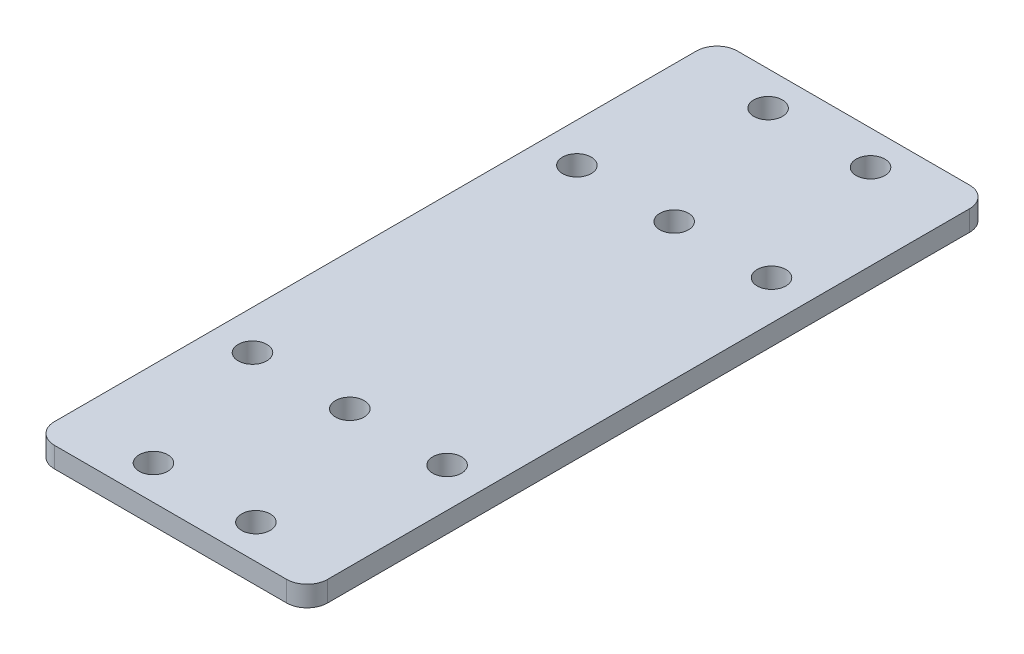
ISO-10303-21;
HEADER;
FILE_DESCRIPTION(('STEP AP214'),'2;1');
FILE_NAME('part.step','',(''),(''),'','','');
FILE_SCHEMA(('AUTOMOTIVE_DESIGN { 1 0 10303 214 1 1 1 1 }'));
ENDSEC;
DATA;
#1=APPLICATION_CONTEXT('core data for automotive mechanical design processes');
#2=APPLICATION_PROTOCOL_DEFINITION('international standard','automotive_design',2000,#1);
#3=PRODUCT_CONTEXT('',#1,'mechanical');
#4=PRODUCT('Part','Part','',(#3));
#5=PRODUCT_RELATED_PRODUCT_CATEGORY('part','',(#4));
#6=PRODUCT_DEFINITION_FORMATION('','',#4);
#7=PRODUCT_DEFINITION_CONTEXT('part definition',#1,'design');
#8=PRODUCT_DEFINITION('design','',#6,#7);
#9=PRODUCT_DEFINITION_SHAPE('','',#8);
#10=(LENGTH_UNIT() NAMED_UNIT(*) SI_UNIT(.MILLI.,.METRE.));
#11=(NAMED_UNIT(*) PLANE_ANGLE_UNIT() SI_UNIT($,.RADIAN.));
#12=(NAMED_UNIT(*) SI_UNIT($,.STERADIAN.) SOLID_ANGLE_UNIT());
#13=UNCERTAINTY_MEASURE_WITH_UNIT(LENGTH_MEASURE(1.E-05),#10,'distance_accuracy_value','');
#14=(GEOMETRIC_REPRESENTATION_CONTEXT(3) GLOBAL_UNCERTAINTY_ASSIGNED_CONTEXT((#13)) GLOBAL_UNIT_ASSIGNED_CONTEXT((#10,
#11,#12)) REPRESENTATION_CONTEXT('',''));
#15=CARTESIAN_POINT('',(0.,0.,0.));
#16=DIRECTION('',(0.,0.,1.));
#17=DIRECTION('',(1.,0.,0.));
#18=AXIS2_PLACEMENT_3D('',#15,#16,#17);
#19=CARTESIAN_POINT('',(0.,3.,0.));
#20=DIRECTION('',(0.,1.,0.));
#21=DIRECTION('',(0.,0.,1.));
#22=AXIS2_PLACEMENT_3D('',#19,#20,#21);
#23=PLANE('',#22);
#24=CARTESIAN_POINT('',(0.,3.,-23.75));
#25=DIRECTION('',(0.,1.,0.));
#26=DIRECTION('',(0.,0.,1.));
#27=AXIS2_PLACEMENT_3D('',#24,#25,#26);
#28=CIRCLE('',#27,2.1);
#29=CARTESIAN_POINT('',(0.,3.,-21.65));
#30=VERTEX_POINT('',#29);
#31=EDGE_CURVE('E264',#30,#30,#28,.T.);
#32=ORIENTED_EDGE('',*,*,#31,.F.);
#33=EDGE_LOOP('',(#32));
#34=FACE_BOUND('',#33,.T.);
#35=CARTESIAN_POINT('',(-7.49999999999998,3.,45.));
#36=DIRECTION('',(0.,1.,0.));
#37=DIRECTION('',(0.,0.,1.));
#38=AXIS2_PLACEMENT_3D('',#35,#36,#37);
#39=CIRCLE('',#38,2.1);
#40=CARTESIAN_POINT('',(-7.49999999999998,3.,47.1));
#41=VERTEX_POINT('',#40);
#42=EDGE_CURVE('E249',#41,#41,#39,.T.);
#43=ORIENTED_EDGE('',*,*,#42,.F.);
#44=EDGE_LOOP('',(#43));
#45=FACE_BOUND('',#44,.T.);
#46=CARTESIAN_POINT('',(7.49999999999999,3.,-45.));
#47=DIRECTION('',(0.,1.,0.));
#48=DIRECTION('',(0.,0.,1.));
#49=AXIS2_PLACEMENT_3D('',#46,#47,#48);
#50=CIRCLE('',#49,2.1);
#51=CARTESIAN_POINT('',(7.49999999999999,3.,-42.9));
#52=VERTEX_POINT('',#51);
#53=EDGE_CURVE('E250',#52,#52,#50,.T.);
#54=ORIENTED_EDGE('',*,*,#53,.F.);
#55=EDGE_LOOP('',(#54));
#56=FACE_BOUND('',#55,.T.);
#57=CARTESIAN_POINT('',(-14.25,3.,23.75));
#58=DIRECTION('',(0.,1.,0.));
#59=DIRECTION('',(0.,0.,1.));
#60=AXIS2_PLACEMENT_3D('',#57,#58,#59);
#61=CIRCLE('',#60,2.1);
#62=CARTESIAN_POINT('',(-14.25,3.,25.85));
#63=VERTEX_POINT('',#62);
#64=EDGE_CURVE('E213',#63,#63,#61,.T.);
#65=ORIENTED_EDGE('',*,*,#64,.F.);
#66=EDGE_LOOP('',(#65));
#67=FACE_BOUND('',#66,.T.);
#68=CARTESIAN_POINT('',(14.25,3.,-23.75));
#69=DIRECTION('',(0.,1.,0.));
#70=DIRECTION('',(0.,0.,1.));
#71=AXIS2_PLACEMENT_3D('',#68,#69,#70);
#72=CIRCLE('',#71,2.1);
#73=CARTESIAN_POINT('',(14.25,3.,-21.65));
#74=VERTEX_POINT('',#73);
#75=EDGE_CURVE('E202',#74,#74,#72,.T.);
#76=ORIENTED_EDGE('',*,*,#75,.F.);
#77=EDGE_LOOP('',(#76));
#78=FACE_BOUND('',#77,.T.);
#79=DIRECTION('',(-1.,0.,0.));
#80=VECTOR('',#79,1.);
#81=CARTESIAN_POINT('',(-20.,3.,-50.));
#82=LINE('',#81,#80);
#83=CARTESIAN_POINT('',(17.,3.,-50.));
#84=VERTEX_POINT('',#83);
#85=CARTESIAN_POINT('',(-17.,3.,-50.));
#86=VERTEX_POINT('',#85);
#87=EDGE_CURVE('E176',#84,#86,#82,.T.);
#88=ORIENTED_EDGE('',*,*,#87,.T.);
#89=CARTESIAN_POINT('',(-17.,3.,-47.));
#90=DIRECTION('',(0.,1.,0.));
#91=DIRECTION('',(0.,0.,1.));
#92=AXIS2_PLACEMENT_3D('',#89,#90,#91);
#93=CIRCLE('',#92,3.);
#94=CARTESIAN_POINT('',(-20.,3.,-47.));
#95=VERTEX_POINT('',#94);
#96=EDGE_CURVE('E188',#86,#95,#93,.T.);
#97=ORIENTED_EDGE('',*,*,#96,.T.);
#98=DIRECTION('',(0.,0.,1.));
#99=VECTOR('',#98,1.);
#100=CARTESIAN_POINT('',(-20.,3.,-50.));
#101=LINE('',#100,#99);
#102=CARTESIAN_POINT('',(-20.,3.,47.));
#103=VERTEX_POINT('',#102);
#104=EDGE_CURVE('E122',#95,#103,#101,.T.);
#105=ORIENTED_EDGE('',*,*,#104,.T.);
#106=CARTESIAN_POINT('',(-17.,3.,47.));
#107=DIRECTION('',(0.,1.,0.));
#108=DIRECTION('',(0.,0.,1.));
#109=AXIS2_PLACEMENT_3D('',#106,#107,#108);
#110=CIRCLE('',#109,3.);
#111=CARTESIAN_POINT('',(-17.,3.,50.));
#112=VERTEX_POINT('',#111);
#113=EDGE_CURVE('E58',#103,#112,#110,.T.);
#114=ORIENTED_EDGE('',*,*,#113,.T.);
#115=DIRECTION('',(1.,0.,0.));
#116=VECTOR('',#115,1.);
#117=CARTESIAN_POINT('',(-20.,3.,50.));
#118=LINE('',#117,#116);
#119=CARTESIAN_POINT('',(17.,3.,50.));
#120=VERTEX_POINT('',#119);
#121=EDGE_CURVE('E138',#112,#120,#118,.T.);
#122=ORIENTED_EDGE('',*,*,#121,.T.);
#123=CARTESIAN_POINT('',(17.,3.,47.));
#124=DIRECTION('',(0.,1.,0.));
#125=DIRECTION('',(0.,0.,1.));
#126=AXIS2_PLACEMENT_3D('',#123,#124,#125);
#127=CIRCLE('',#126,3.);
#128=CARTESIAN_POINT('',(20.,3.,47.));
#129=VERTEX_POINT('',#128);
#130=EDGE_CURVE('E149',#120,#129,#127,.T.);
#131=ORIENTED_EDGE('',*,*,#130,.T.);
#132=DIRECTION('',(0.,0.,-1.));
#133=VECTOR('',#132,1.);
#134=CARTESIAN_POINT('',(20.,3.,-50.));
#135=LINE('',#134,#133);
#136=CARTESIAN_POINT('',(20.,3.,-47.));
#137=VERTEX_POINT('',#136);
#138=EDGE_CURVE('E132',#129,#137,#135,.T.);
#139=ORIENTED_EDGE('',*,*,#138,.T.);
#140=CARTESIAN_POINT('',(17.,3.,-47.));
#141=DIRECTION('',(0.,1.,0.));
#142=DIRECTION('',(0.,0.,1.));
#143=AXIS2_PLACEMENT_3D('',#140,#141,#142);
#144=CIRCLE('',#143,3.);
#145=EDGE_CURVE('E185',#137,#84,#144,.T.);
#146=ORIENTED_EDGE('',*,*,#145,.T.);
#147=EDGE_LOOP('',(#88,#97,#105,#114,#122,#131,#139,#146));
#148=FACE_BOUND('',#147,.T.);
#149=CARTESIAN_POINT('',(-14.25,3.,-23.75));
#150=DIRECTION('',(0.,1.,0.));
#151=DIRECTION('',(0.,0.,-1.));
#152=AXIS2_PLACEMENT_3D('',#149,#150,#151);
#153=CIRCLE('',#152,2.10000000000001);
#154=CARTESIAN_POINT('',(-14.25,3.,-25.85));
#155=VERTEX_POINT('',#154);
#156=EDGE_CURVE('E224',#155,#155,#153,.T.);
#157=ORIENTED_EDGE('',*,*,#156,.F.);
#158=EDGE_LOOP('',(#157));
#159=FACE_BOUND('',#158,.T.);
#160=CARTESIAN_POINT('',(14.25,3.,23.75));
#161=DIRECTION('',(0.,1.,0.));
#162=DIRECTION('',(0.,0.,-1.));
#163=AXIS2_PLACEMENT_3D('',#160,#161,#162);
#164=CIRCLE('',#163,2.10000000000001);
#165=CARTESIAN_POINT('',(14.25,3.,21.65));
#166=VERTEX_POINT('',#165);
#167=EDGE_CURVE('E223',#166,#166,#164,.T.);
#168=ORIENTED_EDGE('',*,*,#167,.F.);
#169=EDGE_LOOP('',(#168));
#170=FACE_BOUND('',#169,.T.);
#171=CARTESIAN_POINT('',(-7.50000000000001,3.,-45.));
#172=DIRECTION('',(0.,1.,0.));
#173=DIRECTION('',(0.,0.,-1.));
#174=AXIS2_PLACEMENT_3D('',#171,#172,#173);
#175=CIRCLE('',#174,2.1);
#176=CARTESIAN_POINT('',(-7.50000000000001,3.,-47.1));
#177=VERTEX_POINT('',#176);
#178=EDGE_CURVE('E239',#177,#177,#175,.T.);
#179=ORIENTED_EDGE('',*,*,#178,.F.);
#180=EDGE_LOOP('',(#179));
#181=FACE_BOUND('',#180,.T.);
#182=CARTESIAN_POINT('',(7.50000000000002,3.,45.));
#183=DIRECTION('',(0.,1.,0.));
#184=DIRECTION('',(0.,0.,-1.));
#185=AXIS2_PLACEMENT_3D('',#182,#183,#184);
#186=CIRCLE('',#185,2.1);
#187=CARTESIAN_POINT('',(7.50000000000002,3.,42.9));
#188=VERTEX_POINT('',#187);
#189=EDGE_CURVE('E274',#188,#188,#186,.T.);
#190=ORIENTED_EDGE('',*,*,#189,.F.);
#191=EDGE_LOOP('',(#190));
#192=FACE_BOUND('',#191,.T.);
#193=CARTESIAN_POINT('',(0.,3.,23.75));
#194=DIRECTION('',(0.,1.,0.));
#195=DIRECTION('',(0.,0.,-1.));
#196=AXIS2_PLACEMENT_3D('',#193,#194,#195);
#197=CIRCLE('',#196,2.1);
#198=CARTESIAN_POINT('',(0.,3.,21.65));
#199=VERTEX_POINT('',#198);
#200=EDGE_CURVE('E273',#199,#199,#197,.T.);
#201=ORIENTED_EDGE('',*,*,#200,.F.);
#202=EDGE_LOOP('',(#201));
#203=FACE_BOUND('',#202,.T.);
#204=ADVANCED_FACE('F38',(#34,#45,#56,#67,#78,#148,#159,#170,#181,#192,#203),#23,.T.);
#205=CARTESIAN_POINT('',(0.,0.,0.));
#206=DIRECTION('',(0.,1.,0.));
#207=DIRECTION('',(0.,0.,1.));
#208=AXIS2_PLACEMENT_3D('',#205,#206,#207);
#209=PLANE('',#208);
#210=DIRECTION('',(0.,0.,1.));
#211=VECTOR('',#210,1.);
#212=CARTESIAN_POINT('',(-20.,0.,-50.));
#213=LINE('',#212,#211);
#214=CARTESIAN_POINT('',(-20.,0.,-47.));
#215=VERTEX_POINT('',#214);
#216=CARTESIAN_POINT('',(-20.,0.,47.));
#217=VERTEX_POINT('',#216);
#218=EDGE_CURVE('E120',#215,#217,#213,.T.);
#219=ORIENTED_EDGE('',*,*,#218,.F.);
#220=CARTESIAN_POINT('',(-17.,0.,-47.));
#221=DIRECTION('',(0.,1.,0.));
#222=DIRECTION('',(0.,0.,1.));
#223=AXIS2_PLACEMENT_3D('',#220,#221,#222);
#224=CIRCLE('',#223,3.);
#225=CARTESIAN_POINT('',(-17.,0.,-50.));
#226=VERTEX_POINT('',#225);
#227=EDGE_CURVE('E103',#215,#226,#224,.F.);
#228=ORIENTED_EDGE('',*,*,#227,.T.);
#229=DIRECTION('',(-1.,0.,0.));
#230=VECTOR('',#229,1.);
#231=CARTESIAN_POINT('',(-20.,0.,-50.));
#232=LINE('',#231,#230);
#233=CARTESIAN_POINT('',(17.,0.,-50.));
#234=VERTEX_POINT('',#233);
#235=EDGE_CURVE('E130',#234,#226,#232,.T.);
#236=ORIENTED_EDGE('',*,*,#235,.F.);
#237=CARTESIAN_POINT('',(17.,0.,-47.));
#238=DIRECTION('',(0.,1.,0.));
#239=DIRECTION('',(0.,0.,1.));
#240=AXIS2_PLACEMENT_3D('',#237,#238,#239);
#241=CIRCLE('',#240,3.);
#242=CARTESIAN_POINT('',(20.,0.,-47.));
#243=VERTEX_POINT('',#242);
#244=EDGE_CURVE('E114',#234,#243,#241,.F.);
#245=ORIENTED_EDGE('',*,*,#244,.T.);
#246=DIRECTION('',(0.,0.,-1.));
#247=VECTOR('',#246,1.);
#248=CARTESIAN_POINT('',(20.,0.,-50.));
#249=LINE('',#248,#247);
#250=CARTESIAN_POINT('',(20.,0.,47.));
#251=VERTEX_POINT('',#250);
#252=EDGE_CURVE('E134',#251,#243,#249,.T.);
#253=ORIENTED_EDGE('',*,*,#252,.F.);
#254=CARTESIAN_POINT('',(17.,0.,47.));
#255=DIRECTION('',(0.,1.,0.));
#256=DIRECTION('',(0.,0.,1.));
#257=AXIS2_PLACEMENT_3D('',#254,#255,#256);
#258=CIRCLE('',#257,3.);
#259=CARTESIAN_POINT('',(17.,0.,50.));
#260=VERTEX_POINT('',#259);
#261=EDGE_CURVE('E141',#251,#260,#258,.F.);
#262=ORIENTED_EDGE('',*,*,#261,.T.);
#263=DIRECTION('',(1.,0.,0.));
#264=VECTOR('',#263,1.);
#265=CARTESIAN_POINT('',(-20.,0.,50.));
#266=LINE('',#265,#264);
#267=CARTESIAN_POINT('',(-17.,0.,50.));
#268=VERTEX_POINT('',#267);
#269=EDGE_CURVE('E129',#268,#260,#266,.T.);
#270=ORIENTED_EDGE('',*,*,#269,.F.);
#271=CARTESIAN_POINT('',(-17.,0.,47.));
#272=DIRECTION('',(0.,1.,0.));
#273=DIRECTION('',(0.,0.,1.));
#274=AXIS2_PLACEMENT_3D('',#271,#272,#273);
#275=CIRCLE('',#274,3.);
#276=EDGE_CURVE('E123',#268,#217,#275,.F.);
#277=ORIENTED_EDGE('',*,*,#276,.T.);
#278=EDGE_LOOP('',(#219,#228,#236,#245,#253,#262,#270,#277));
#279=FACE_BOUND('',#278,.T.);
#280=CARTESIAN_POINT('',(14.25,0.,-23.75));
#281=DIRECTION('',(0.,1.,0.));
#282=DIRECTION('',(0.,0.,1.));
#283=AXIS2_PLACEMENT_3D('',#280,#281,#282);
#284=CIRCLE('',#283,2.1);
#285=CARTESIAN_POINT('',(14.25,0.,-21.65));
#286=VERTEX_POINT('',#285);
#287=EDGE_CURVE('E177',#286,#286,#284,.T.);
#288=ORIENTED_EDGE('',*,*,#287,.T.);
#289=EDGE_LOOP('',(#288));
#290=FACE_BOUND('',#289,.T.);
#291=CARTESIAN_POINT('',(-14.25,0.,-23.75));
#292=DIRECTION('',(0.,1.,0.));
#293=DIRECTION('',(0.,0.,-1.));
#294=AXIS2_PLACEMENT_3D('',#291,#292,#293);
#295=CIRCLE('',#294,2.10000000000001);
#296=CARTESIAN_POINT('',(-14.25,0.,-25.85));
#297=VERTEX_POINT('',#296);
#298=EDGE_CURVE('E206',#297,#297,#295,.T.);
#299=ORIENTED_EDGE('',*,*,#298,.T.);
#300=EDGE_LOOP('',(#299));
#301=FACE_BOUND('',#300,.T.);
#302=CARTESIAN_POINT('',(-14.25,0.,23.75));
#303=DIRECTION('',(0.,1.,0.));
#304=DIRECTION('',(0.,0.,1.));
#305=AXIS2_PLACEMENT_3D('',#302,#303,#304);
#306=CIRCLE('',#305,2.1);
#307=CARTESIAN_POINT('',(-14.25,0.,25.85));
#308=VERTEX_POINT('',#307);
#309=EDGE_CURVE('E218',#308,#308,#306,.T.);
#310=ORIENTED_EDGE('',*,*,#309,.T.);
#311=EDGE_LOOP('',(#310));
#312=FACE_BOUND('',#311,.T.);
#313=CARTESIAN_POINT('',(14.25,0.,23.75));
#314=DIRECTION('',(0.,1.,0.));
#315=DIRECTION('',(0.,0.,-1.));
#316=AXIS2_PLACEMENT_3D('',#313,#314,#315);
#317=CIRCLE('',#316,2.10000000000001);
#318=CARTESIAN_POINT('',(14.25,0.,21.65));
#319=VERTEX_POINT('',#318);
#320=EDGE_CURVE('E219',#319,#319,#317,.T.);
#321=ORIENTED_EDGE('',*,*,#320,.T.);
#322=EDGE_LOOP('',(#321));
#323=FACE_BOUND('',#322,.T.);
#324=CARTESIAN_POINT('',(7.49999999999999,0.,-45.));
#325=DIRECTION('',(0.,1.,0.));
#326=DIRECTION('',(0.,0.,1.));
#327=AXIS2_PLACEMENT_3D('',#324,#325,#326);
#328=CIRCLE('',#327,2.1);
#329=CARTESIAN_POINT('',(7.49999999999999,0.,-42.9));
#330=VERTEX_POINT('',#329);
#331=EDGE_CURVE('E235',#330,#330,#328,.T.);
#332=ORIENTED_EDGE('',*,*,#331,.T.);
#333=EDGE_LOOP('',(#332));
#334=FACE_BOUND('',#333,.T.);
#335=CARTESIAN_POINT('',(-7.50000000000001,0.,-45.));
#336=DIRECTION('',(0.,1.,0.));
#337=DIRECTION('',(0.,0.,-1.));
#338=AXIS2_PLACEMENT_3D('',#335,#336,#337);
#339=CIRCLE('',#338,2.1);
#340=CARTESIAN_POINT('',(-7.50000000000001,0.,-47.1));
#341=VERTEX_POINT('',#340);
#342=EDGE_CURVE('E244',#341,#341,#339,.T.);
#343=ORIENTED_EDGE('',*,*,#342,.T.);
#344=EDGE_LOOP('',(#343));
#345=FACE_BOUND('',#344,.T.);
#346=CARTESIAN_POINT('',(-7.49999999999998,0.,45.));
#347=DIRECTION('',(0.,1.,0.));
#348=DIRECTION('',(0.,0.,1.));
#349=AXIS2_PLACEMENT_3D('',#346,#347,#348);
#350=CIRCLE('',#349,2.1);
#351=CARTESIAN_POINT('',(-7.49999999999998,0.,47.1));
#352=VERTEX_POINT('',#351);
#353=EDGE_CURVE('E245',#352,#352,#350,.T.);
#354=ORIENTED_EDGE('',*,*,#353,.T.);
#355=EDGE_LOOP('',(#354));
#356=FACE_BOUND('',#355,.T.);
#357=CARTESIAN_POINT('',(7.50000000000002,0.,45.));
#358=DIRECTION('',(0.,1.,0.));
#359=DIRECTION('',(0.,0.,-1.));
#360=AXIS2_PLACEMENT_3D('',#357,#358,#359);
#361=CIRCLE('',#360,2.1);
#362=CARTESIAN_POINT('',(7.50000000000002,0.,42.9));
#363=VERTEX_POINT('',#362);
#364=EDGE_CURVE('E261',#363,#363,#361,.T.);
#365=ORIENTED_EDGE('',*,*,#364,.T.);
#366=EDGE_LOOP('',(#365));
#367=FACE_BOUND('',#366,.T.);
#368=CARTESIAN_POINT('',(0.,0.,-23.75));
#369=DIRECTION('',(0.,1.,0.));
#370=DIRECTION('',(0.,0.,1.));
#371=AXIS2_PLACEMENT_3D('',#368,#369,#370);
#372=CIRCLE('',#371,2.1);
#373=CARTESIAN_POINT('',(0.,0.,-21.65));
#374=VERTEX_POINT('',#373);
#375=EDGE_CURVE('E269',#374,#374,#372,.T.);
#376=ORIENTED_EDGE('',*,*,#375,.T.);
#377=EDGE_LOOP('',(#376));
#378=FACE_BOUND('',#377,.T.);
#379=CARTESIAN_POINT('',(0.,0.,23.75));
#380=DIRECTION('',(0.,1.,0.));
#381=DIRECTION('',(0.,0.,-1.));
#382=AXIS2_PLACEMENT_3D('',#379,#380,#381);
#383=CIRCLE('',#382,2.1);
#384=CARTESIAN_POINT('',(0.,0.,21.65));
#385=VERTEX_POINT('',#384);
#386=EDGE_CURVE('E270',#385,#385,#383,.T.);
#387=ORIENTED_EDGE('',*,*,#386,.T.);
#388=EDGE_LOOP('',(#387));
#389=FACE_BOUND('',#388,.T.);
#390=ADVANCED_FACE('F126',(#279,#290,#301,#312,#323,#334,#345,#356,#367,#378,#389),#209,.F.);
#391=CARTESIAN_POINT('',(20.,3.,-50.));
#392=DIRECTION('',(-1.,0.,0.));
#393=DIRECTION('',(0.,0.,1.));
#394=AXIS2_PLACEMENT_3D('',#391,#392,#393);
#395=PLANE('',#394);
#396=ORIENTED_EDGE('',*,*,#252,.T.);
#397=DIRECTION('',(0.,-1.,0.));
#398=VECTOR('',#397,1.);
#399=CARTESIAN_POINT('',(20.,3.,-47.));
#400=LINE('',#399,#398);
#401=EDGE_CURVE('E345',#243,#137,#400,.F.);
#402=ORIENTED_EDGE('',*,*,#401,.T.);
#403=ORIENTED_EDGE('',*,*,#138,.F.);
#404=DIRECTION('',(0.,-1.,0.));
#405=VECTOR('',#404,1.);
#406=CARTESIAN_POINT('',(20.,3.,47.));
#407=LINE('',#406,#405);
#408=EDGE_CURVE('E192',#129,#251,#407,.T.);
#409=ORIENTED_EDGE('',*,*,#408,.T.);
#410=EDGE_LOOP('',(#396,#402,#403,#409));
#411=FACE_BOUND('',#410,.T.);
#412=ADVANCED_FACE('F306',(#411),#395,.F.);
#413=CARTESIAN_POINT('',(-20.,3.,-50.));
#414=DIRECTION('',(0.,0.,1.));
#415=DIRECTION('',(1.,0.,0.));
#416=AXIS2_PLACEMENT_3D('',#413,#414,#415);
#417=PLANE('',#416);
#418=ORIENTED_EDGE('',*,*,#235,.T.);
#419=DIRECTION('',(0.,-1.,0.));
#420=VECTOR('',#419,1.);
#421=CARTESIAN_POINT('',(-17.,3.,-50.));
#422=LINE('',#421,#420);
#423=EDGE_CURVE('E108',#226,#86,#422,.F.);
#424=ORIENTED_EDGE('',*,*,#423,.T.);
#425=ORIENTED_EDGE('',*,*,#87,.F.);
#426=DIRECTION('',(0.,-1.,0.));
#427=VECTOR('',#426,1.);
#428=CARTESIAN_POINT('',(17.,3.,-50.));
#429=LINE('',#428,#427);
#430=EDGE_CURVE('E113',#84,#234,#429,.T.);
#431=ORIENTED_EDGE('',*,*,#430,.T.);
#432=EDGE_LOOP('',(#418,#424,#425,#431));
#433=FACE_BOUND('',#432,.T.);
#434=ADVANCED_FACE('F319',(#433),#417,.F.);
#435=CARTESIAN_POINT('',(-20.,3.,-50.));
#436=DIRECTION('',(1.,0.,0.));
#437=DIRECTION('',(0.,0.,-1.));
#438=AXIS2_PLACEMENT_3D('',#435,#436,#437);
#439=PLANE('',#438);
#440=ORIENTED_EDGE('',*,*,#104,.F.);
#441=DIRECTION('',(0.,-1.,0.));
#442=VECTOR('',#441,1.);
#443=CARTESIAN_POINT('',(-20.,3.,-47.));
#444=LINE('',#443,#442);
#445=EDGE_CURVE('E107',#95,#215,#444,.T.);
#446=ORIENTED_EDGE('',*,*,#445,.T.);
#447=ORIENTED_EDGE('',*,*,#218,.T.);
#448=DIRECTION('',(0.,-1.,0.));
#449=VECTOR('',#448,1.);
#450=CARTESIAN_POINT('',(-20.,3.,47.));
#451=LINE('',#450,#449);
#452=EDGE_CURVE('E124',#217,#103,#451,.F.);
#453=ORIENTED_EDGE('',*,*,#452,.T.);
#454=EDGE_LOOP('',(#440,#446,#447,#453));
#455=FACE_BOUND('',#454,.T.);
#456=ADVANCED_FACE('F119',(#455),#439,.F.);
#457=CARTESIAN_POINT('',(-20.,3.,50.));
#458=DIRECTION('',(0.,0.,-1.));
#459=DIRECTION('',(-1.,0.,0.));
#460=AXIS2_PLACEMENT_3D('',#457,#458,#459);
#461=PLANE('',#460);
#462=ORIENTED_EDGE('',*,*,#269,.T.);
#463=DIRECTION('',(0.,-1.,0.));
#464=VECTOR('',#463,1.);
#465=CARTESIAN_POINT('',(17.,3.,50.));
#466=LINE('',#465,#464);
#467=EDGE_CURVE('E12',#260,#120,#466,.F.);
#468=ORIENTED_EDGE('',*,*,#467,.T.);
#469=ORIENTED_EDGE('',*,*,#121,.F.);
#470=DIRECTION('',(0.,-1.,0.));
#471=VECTOR('',#470,1.);
#472=CARTESIAN_POINT('',(-17.,3.,50.));
#473=LINE('',#472,#471);
#474=EDGE_CURVE('E46',#112,#268,#473,.T.);
#475=ORIENTED_EDGE('',*,*,#474,.T.);
#476=EDGE_LOOP('',(#462,#468,#469,#475));
#477=FACE_BOUND('',#476,.T.);
#478=ADVANCED_FACE('F314',(#477),#461,.F.);
#479=CARTESIAN_POINT('',(14.25,3.,-23.75));
#480=DIRECTION('',(0.,-1.,0.));
#481=DIRECTION('',(0.,0.,-1.));
#482=AXIS2_PLACEMENT_3D('',#479,#480,#481);
#483=CYLINDRICAL_SURFACE('',#482,2.1);
#484=ORIENTED_EDGE('',*,*,#75,.T.);
#485=EDGE_LOOP('',(#484));
#486=FACE_BOUND('',#485,.T.);
#487=ORIENTED_EDGE('',*,*,#287,.F.);
#488=EDGE_LOOP('',(#487));
#489=FACE_BOUND('',#488,.T.);
#490=ADVANCED_FACE('F311',(#486,#489),#483,.F.);
#491=CARTESIAN_POINT('',(-14.25,3.,-23.75));
#492=DIRECTION('',(0.,-1.,0.));
#493=DIRECTION('',(0.,0.,-1.));
#494=AXIS2_PLACEMENT_3D('',#491,#492,#493);
#495=CYLINDRICAL_SURFACE('',#494,2.10000000000001);
#496=ORIENTED_EDGE('',*,*,#156,.T.);
#497=EDGE_LOOP('',(#496));
#498=FACE_BOUND('',#497,.T.);
#499=ORIENTED_EDGE('',*,*,#298,.F.);
#500=EDGE_LOOP('',(#499));
#501=FACE_BOUND('',#500,.T.);
#502=ADVANCED_FACE('F389',(#498,#501),#495,.F.);
#503=CARTESIAN_POINT('',(-14.25,3.,23.75));
#504=DIRECTION('',(0.,-1.,0.));
#505=DIRECTION('',(0.,0.,-1.));
#506=AXIS2_PLACEMENT_3D('',#503,#504,#505);
#507=CYLINDRICAL_SURFACE('',#506,2.1);
#508=ORIENTED_EDGE('',*,*,#64,.T.);
#509=EDGE_LOOP('',(#508));
#510=FACE_BOUND('',#509,.T.);
#511=ORIENTED_EDGE('',*,*,#309,.F.);
#512=EDGE_LOOP('',(#511));
#513=FACE_BOUND('',#512,.T.);
#514=ADVANCED_FACE('F386',(#510,#513),#507,.F.);
#515=CARTESIAN_POINT('',(14.25,3.,23.75));
#516=DIRECTION('',(0.,-1.,0.));
#517=DIRECTION('',(0.,0.,-1.));
#518=AXIS2_PLACEMENT_3D('',#515,#516,#517);
#519=CYLINDRICAL_SURFACE('',#518,2.10000000000001);
#520=ORIENTED_EDGE('',*,*,#167,.T.);
#521=EDGE_LOOP('',(#520));
#522=FACE_BOUND('',#521,.T.);
#523=ORIENTED_EDGE('',*,*,#320,.F.);
#524=EDGE_LOOP('',(#523));
#525=FACE_BOUND('',#524,.T.);
#526=ADVANCED_FACE('F382',(#522,#525),#519,.F.);
#527=CARTESIAN_POINT('',(7.49999999999999,3.,-45.));
#528=DIRECTION('',(0.,-1.,0.));
#529=DIRECTION('',(0.,0.,-1.));
#530=AXIS2_PLACEMENT_3D('',#527,#528,#529);
#531=CYLINDRICAL_SURFACE('',#530,2.1);
#532=ORIENTED_EDGE('',*,*,#53,.T.);
#533=EDGE_LOOP('',(#532));
#534=FACE_BOUND('',#533,.T.);
#535=ORIENTED_EDGE('',*,*,#331,.F.);
#536=EDGE_LOOP('',(#535));
#537=FACE_BOUND('',#536,.T.);
#538=ADVANCED_FACE('F378',(#534,#537),#531,.F.);
#539=CARTESIAN_POINT('',(-7.50000000000001,3.,-45.));
#540=DIRECTION('',(0.,-1.,0.));
#541=DIRECTION('',(0.,0.,-1.));
#542=AXIS2_PLACEMENT_3D('',#539,#540,#541);
#543=CYLINDRICAL_SURFACE('',#542,2.1);
#544=ORIENTED_EDGE('',*,*,#178,.T.);
#545=EDGE_LOOP('',(#544));
#546=FACE_BOUND('',#545,.T.);
#547=ORIENTED_EDGE('',*,*,#342,.F.);
#548=EDGE_LOOP('',(#547));
#549=FACE_BOUND('',#548,.T.);
#550=ADVANCED_FACE('F372',(#546,#549),#543,.F.);
#551=CARTESIAN_POINT('',(-7.49999999999998,3.,45.));
#552=DIRECTION('',(0.,-1.,0.));
#553=DIRECTION('',(0.,0.,-1.));
#554=AXIS2_PLACEMENT_3D('',#551,#552,#553);
#555=CYLINDRICAL_SURFACE('',#554,2.1);
#556=ORIENTED_EDGE('',*,*,#42,.T.);
#557=EDGE_LOOP('',(#556));
#558=FACE_BOUND('',#557,.T.);
#559=ORIENTED_EDGE('',*,*,#353,.F.);
#560=EDGE_LOOP('',(#559));
#561=FACE_BOUND('',#560,.T.);
#562=ADVANCED_FACE('F361',(#558,#561),#555,.F.);
#563=CARTESIAN_POINT('',(7.50000000000002,3.,45.));
#564=DIRECTION('',(0.,-1.,0.));
#565=DIRECTION('',(0.,0.,-1.));
#566=AXIS2_PLACEMENT_3D('',#563,#564,#565);
#567=CYLINDRICAL_SURFACE('',#566,2.1);
#568=ORIENTED_EDGE('',*,*,#189,.T.);
#569=EDGE_LOOP('',(#568));
#570=FACE_BOUND('',#569,.T.);
#571=ORIENTED_EDGE('',*,*,#364,.F.);
#572=EDGE_LOOP('',(#571));
#573=FACE_BOUND('',#572,.T.);
#574=ADVANCED_FACE('F297',(#570,#573),#567,.F.);
#575=CARTESIAN_POINT('',(0.,3.,-23.75));
#576=DIRECTION('',(0.,-1.,0.));
#577=DIRECTION('',(0.,0.,-1.));
#578=AXIS2_PLACEMENT_3D('',#575,#576,#577);
#579=CYLINDRICAL_SURFACE('',#578,2.1);
#580=ORIENTED_EDGE('',*,*,#31,.T.);
#581=EDGE_LOOP('',(#580));
#582=FACE_BOUND('',#581,.T.);
#583=ORIENTED_EDGE('',*,*,#375,.F.);
#584=EDGE_LOOP('',(#583));
#585=FACE_BOUND('',#584,.T.);
#586=ADVANCED_FACE('F289',(#582,#585),#579,.F.);
#587=CARTESIAN_POINT('',(0.,3.,23.75));
#588=DIRECTION('',(0.,-1.,0.));
#589=DIRECTION('',(0.,0.,-1.));
#590=AXIS2_PLACEMENT_3D('',#587,#588,#589);
#591=CYLINDRICAL_SURFACE('',#590,2.1);
#592=ORIENTED_EDGE('',*,*,#200,.T.);
#593=EDGE_LOOP('',(#592));
#594=FACE_BOUND('',#593,.T.);
#595=ORIENTED_EDGE('',*,*,#386,.F.);
#596=EDGE_LOOP('',(#595));
#597=FACE_BOUND('',#596,.T.);
#598=ADVANCED_FACE('F287',(#594,#597),#591,.F.);
#599=CARTESIAN_POINT('',(-17.,3.,-47.));
#600=DIRECTION('',(0.,-1.,0.));
#601=DIRECTION('',(0.,0.,-1.));
#602=AXIS2_PLACEMENT_3D('',#599,#600,#601);
#603=CYLINDRICAL_SURFACE('',#602,3.);
#604=ORIENTED_EDGE('',*,*,#96,.F.);
#605=ORIENTED_EDGE('',*,*,#423,.F.);
#606=ORIENTED_EDGE('',*,*,#227,.F.);
#607=ORIENTED_EDGE('',*,*,#445,.F.);
#608=EDGE_LOOP('',(#604,#605,#606,#607));
#609=FACE_BOUND('',#608,.T.);
#610=ADVANCED_FACE('F106',(#609),#603,.T.);
#611=CARTESIAN_POINT('',(17.,3.,-47.));
#612=DIRECTION('',(0.,-1.,0.));
#613=DIRECTION('',(0.,0.,-1.));
#614=AXIS2_PLACEMENT_3D('',#611,#612,#613);
#615=CYLINDRICAL_SURFACE('',#614,3.);
#616=ORIENTED_EDGE('',*,*,#145,.F.);
#617=ORIENTED_EDGE('',*,*,#401,.F.);
#618=ORIENTED_EDGE('',*,*,#244,.F.);
#619=ORIENTED_EDGE('',*,*,#430,.F.);
#620=EDGE_LOOP('',(#616,#617,#618,#619));
#621=FACE_BOUND('',#620,.T.);
#622=ADVANCED_FACE('F295',(#621),#615,.T.);
#623=CARTESIAN_POINT('',(17.,3.,47.));
#624=DIRECTION('',(0.,-1.,0.));
#625=DIRECTION('',(0.,0.,-1.));
#626=AXIS2_PLACEMENT_3D('',#623,#624,#625);
#627=CYLINDRICAL_SURFACE('',#626,3.);
#628=ORIENTED_EDGE('',*,*,#130,.F.);
#629=ORIENTED_EDGE('',*,*,#467,.F.);
#630=ORIENTED_EDGE('',*,*,#261,.F.);
#631=ORIENTED_EDGE('',*,*,#408,.F.);
#632=EDGE_LOOP('',(#628,#629,#630,#631));
#633=FACE_BOUND('',#632,.T.);
#634=ADVANCED_FACE('F327',(#633),#627,.T.);
#635=CARTESIAN_POINT('',(-17.,3.,47.));
#636=DIRECTION('',(0.,-1.,0.));
#637=DIRECTION('',(0.,0.,-1.));
#638=AXIS2_PLACEMENT_3D('',#635,#636,#637);
#639=CYLINDRICAL_SURFACE('',#638,3.);
#640=ORIENTED_EDGE('',*,*,#113,.F.);
#641=ORIENTED_EDGE('',*,*,#452,.F.);
#642=ORIENTED_EDGE('',*,*,#276,.F.);
#643=ORIENTED_EDGE('',*,*,#474,.F.);
#644=EDGE_LOOP('',(#640,#641,#642,#643));
#645=FACE_BOUND('',#644,.T.);
#646=ADVANCED_FACE('F40',(#645),#639,.T.);
#647=CLOSED_SHELL('',(#204,#390,#412,#434,#456,#478,#490,#502,#514,#526,#538,#550,#562,#574,
#586,#598,#610,#622,#634,#646));
#648=MANIFOLD_SOLID_BREP('B2',#647);
#649=ADVANCED_BREP_SHAPE_REPRESENTATION('',(#18,#648),#14);
#650=SHAPE_DEFINITION_REPRESENTATION(#9,#649);
ENDSEC;
END-ISO-10303-21;
